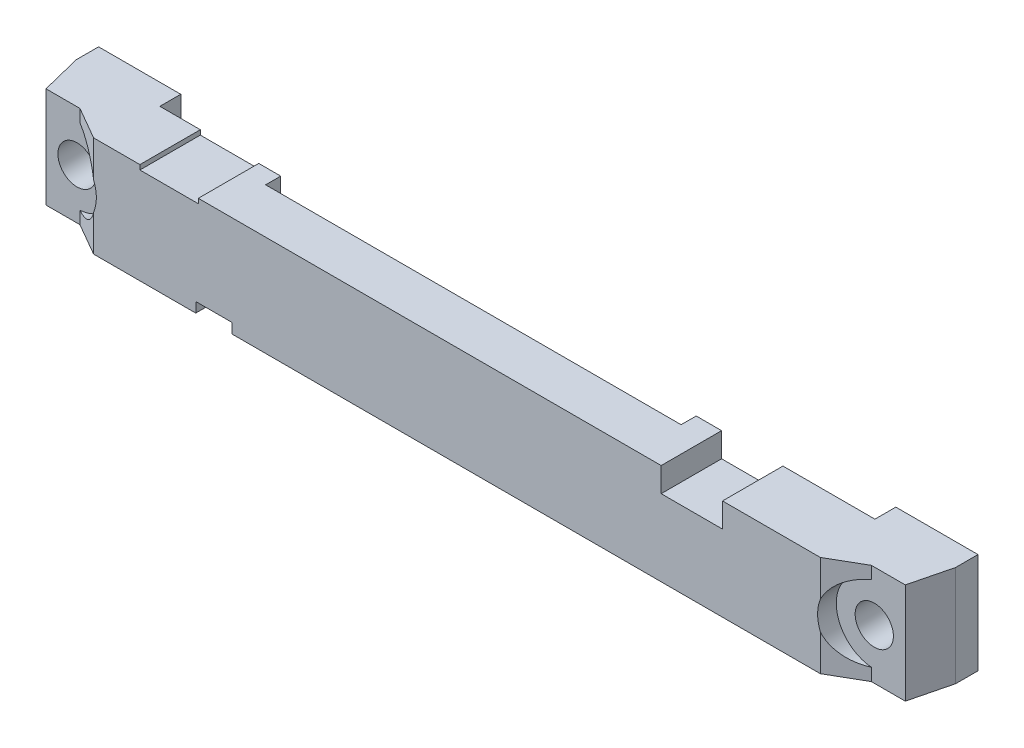
ISO-10303-21;
HEADER;
FILE_DESCRIPTION(('STEP AP214'),'2;1');
FILE_NAME('part.step','',(''),(''),'','','');
FILE_SCHEMA(('AUTOMOTIVE_DESIGN { 1 0 10303 214 1 1 1 1 }'));
ENDSEC;
DATA;
#1=APPLICATION_CONTEXT('core data for automotive mechanical design processes');
#2=APPLICATION_PROTOCOL_DEFINITION('international standard','automotive_design',2000,#1);
#3=PRODUCT_CONTEXT('',#1,'mechanical');
#4=PRODUCT('Part','Part','',(#3));
#5=PRODUCT_RELATED_PRODUCT_CATEGORY('part','',(#4));
#6=PRODUCT_DEFINITION_FORMATION('','',#4);
#7=PRODUCT_DEFINITION_CONTEXT('part definition',#1,'design');
#8=PRODUCT_DEFINITION('design','',#6,#7);
#9=PRODUCT_DEFINITION_SHAPE('','',#8);
#10=(LENGTH_UNIT() NAMED_UNIT(*) SI_UNIT(.MILLI.,.METRE.));
#11=(NAMED_UNIT(*) PLANE_ANGLE_UNIT() SI_UNIT($,.RADIAN.));
#12=(NAMED_UNIT(*) SI_UNIT($,.STERADIAN.) SOLID_ANGLE_UNIT());
#13=UNCERTAINTY_MEASURE_WITH_UNIT(LENGTH_MEASURE(1.E-05),#10,'distance_accuracy_value','');
#14=(GEOMETRIC_REPRESENTATION_CONTEXT(3) GLOBAL_UNCERTAINTY_ASSIGNED_CONTEXT((#13)) GLOBAL_UNIT_ASSIGNED_CONTEXT((#10,
#11,#12)) REPRESENTATION_CONTEXT('',''));
#15=CARTESIAN_POINT('',(0.,0.,0.));
#16=DIRECTION('',(0.,0.,1.));
#17=DIRECTION('',(1.,0.,0.));
#18=AXIS2_PLACEMENT_3D('',#15,#16,#17);
#19=CARTESIAN_POINT('',(0.,0.,0.));
#20=DIRECTION('',(0.,0.,1.));
#21=DIRECTION('',(1.,0.,0.));
#22=AXIS2_PLACEMENT_3D('',#19,#20,#21);
#23=PLANE('',#22);
#24=DIRECTION('',(1.,0.,0.));
#25=VECTOR('',#24,1.);
#26=CARTESIAN_POINT('',(0.,0.,0.));
#27=LINE('',#26,#25);
#28=CARTESIAN_POINT('',(61.4149026290676,0.,0.));
#29=VERTEX_POINT('',#28);
#30=CARTESIAN_POINT('',(79.1605080756888,0.,0.));
#31=VERTEX_POINT('',#30);
#32=EDGE_CURVE('E436',#29,#31,#27,.T.);
#33=ORIENTED_EDGE('',*,*,#32,.F.);
#34=DIRECTION('',(0.,-1.,0.));
#35=VECTOR('',#34,1.);
#36=CARTESIAN_POINT('',(61.4149026290676,10.,0.));
#37=LINE('',#36,#35);
#38=CARTESIAN_POINT('',(61.4149026290676,10.,0.));
#39=VERTEX_POINT('',#38);
#40=EDGE_CURVE('E266',#39,#29,#37,.T.);
#41=ORIENTED_EDGE('',*,*,#40,.F.);
#42=DIRECTION('',(-1.,0.,0.));
#43=VECTOR('',#42,1.);
#44=CARTESIAN_POINT('',(0.,10.,0.));
#45=LINE('',#44,#43);
#46=CARTESIAN_POINT('',(63.9370824595012,10.,0.));
#47=VERTEX_POINT('',#46);
#48=EDGE_CURVE('E454',#47,#39,#45,.T.);
#49=ORIENTED_EDGE('',*,*,#48,.F.);
#50=DIRECTION('',(0.,-1.,0.));
#51=VECTOR('',#50,1.);
#52=CARTESIAN_POINT('',(63.9370824595012,0.,0.));
#53=LINE('',#52,#51);
#54=CARTESIAN_POINT('',(63.9370824595012,7.57883713062101,0.));
#55=VERTEX_POINT('',#54);
#56=EDGE_CURVE('E348',#47,#55,#53,.T.);
#57=ORIENTED_EDGE('',*,*,#56,.T.);
#58=DIRECTION('',(1.,0.,0.));
#59=VECTOR('',#58,1.);
#60=CARTESIAN_POINT('',(0.,7.57883713062101,0.));
#61=LINE('',#60,#59);
#62=CARTESIAN_POINT('',(70.0270798995012,7.57883713062101,0.));
#63=VERTEX_POINT('',#62);
#64=EDGE_CURVE('E306',#55,#63,#61,.T.);
#65=ORIENTED_EDGE('',*,*,#64,.T.);
#66=DIRECTION('',(0.,1.,0.));
#67=VECTOR('',#66,1.);
#68=CARTESIAN_POINT('',(70.0270798995012,0.,0.));
#69=LINE('',#68,#67);
#70=CARTESIAN_POINT('',(70.0270798995012,10.,0.));
#71=VERTEX_POINT('',#70);
#72=EDGE_CURVE('E345',#63,#71,#69,.T.);
#73=ORIENTED_EDGE('',*,*,#72,.T.);
#74=CARTESIAN_POINT('',(79.1605080756888,10.,0.));
#75=VERTEX_POINT('',#74);
#76=EDGE_CURVE('E451',#75,#71,#45,.T.);
#77=ORIENTED_EDGE('',*,*,#76,.F.);
#78=DIRECTION('',(0.,1.,0.));
#79=VECTOR('',#78,1.);
#80=CARTESIAN_POINT('',(79.1605080756888,10.,0.));
#81=LINE('',#80,#79);
#82=EDGE_CURVE('E405',#31,#75,#81,.T.);
#83=ORIENTED_EDGE('',*,*,#82,.F.);
#84=EDGE_LOOP('',(#33,#41,#49,#57,#65,#73,#77,#83));
#85=FACE_BOUND('',#84,.T.);
#86=ADVANCED_FACE('F38',(#85),#23,.F.);
#87=CARTESIAN_POINT('',(21.3225938245012,0.,-2.075));
#88=DIRECTION('',(1.,0.,0.));
#89=DIRECTION('',(0.,0.,-1.));
#90=AXIS2_PLACEMENT_3D('',#87,#88,#89);
#91=PLANE('',#90);
#92=DIRECTION('',(0.,1.,0.));
#93=VECTOR('',#92,1.);
#94=CARTESIAN_POINT('',(21.3225938245012,0.,1.5));
#95=LINE('',#94,#93);
#96=CARTESIAN_POINT('',(21.3225938245012,0.,1.5));
#97=VERTEX_POINT('',#96);
#98=CARTESIAN_POINT('',(21.3225938245012,0.998319284991011,1.5));
#99=VERTEX_POINT('',#98);
#100=EDGE_CURVE('E47',#97,#99,#95,.T.);
#101=ORIENTED_EDGE('',*,*,#100,.F.);
#102=DIRECTION('',(0.,0.,1.));
#103=VECTOR('',#102,1.);
#104=CARTESIAN_POINT('',(21.3225938245012,0.,-2.075));
#105=LINE('',#104,#103);
#106=CARTESIAN_POINT('',(21.3225938245012,0.,6.));
#107=VERTEX_POINT('',#106);
#108=EDGE_CURVE('E280',#97,#107,#105,.T.);
#109=ORIENTED_EDGE('',*,*,#108,.T.);
#110=DIRECTION('',(0.,1.,0.));
#111=VECTOR('',#110,1.);
#112=CARTESIAN_POINT('',(21.3225938245012,0.,6.));
#113=LINE('',#112,#111);
#114=CARTESIAN_POINT('',(21.3225938245012,0.998319284991011,6.));
#115=VERTEX_POINT('',#114);
#116=EDGE_CURVE('E297',#107,#115,#113,.T.);
#117=ORIENTED_EDGE('',*,*,#116,.T.);
#118=DIRECTION('',(0.,0.,1.));
#119=VECTOR('',#118,1.);
#120=CARTESIAN_POINT('',(21.3225938245012,0.998319284991011,-2.075));
#121=LINE('',#120,#119);
#122=EDGE_CURVE('E307',#99,#115,#121,.T.);
#123=ORIENTED_EDGE('',*,*,#122,.F.);
#124=EDGE_LOOP('',(#101,#109,#117,#123));
#125=FACE_BOUND('',#124,.T.);
#126=ADVANCED_FACE('F529',(#125),#91,.F.);
#127=CARTESIAN_POINT('',(0.,0.,6.));
#128=DIRECTION('',(0.,1.,0.));
#129=DIRECTION('',(0.,0.,1.));
#130=AXIS2_PLACEMENT_3D('',#127,#128,#129);
#131=PLANE('',#130);
#132=CARTESIAN_POINT('',(8.16,0.,0.));
#133=VERTEX_POINT('',#132);
#134=CARTESIAN_POINT('',(17.7236099445012,0.,0.));
#135=VERTEX_POINT('',#134);
#136=EDGE_CURVE('E447',#133,#135,#27,.T.);
#137=ORIENTED_EDGE('',*,*,#136,.T.);
#138=DIRECTION('',(0.,0.,1.));
#139=VECTOR('',#138,1.);
#140=CARTESIAN_POINT('',(17.7236099445012,0.,-2.075));
#141=LINE('',#140,#139);
#142=CARTESIAN_POINT('',(17.7236099445012,0.,6.));
#143=VERTEX_POINT('',#142);
#144=EDGE_CURVE('E303',#135,#143,#141,.T.);
#145=ORIENTED_EDGE('',*,*,#144,.T.);
#146=DIRECTION('',(1.,0.,0.));
#147=VECTOR('',#146,1.);
#148=CARTESIAN_POINT('',(0.,0.,6.));
#149=LINE('',#148,#147);
#150=CARTESIAN_POINT('',(7.58000000000001,0.,6.));
#151=VERTEX_POINT('',#150);
#152=EDGE_CURVE('E437',#151,#143,#149,.T.);
#153=ORIENTED_EDGE('',*,*,#152,.F.);
#154=DIRECTION('',(-0.866025403784435,0.,-0.500000000000006));
#155=VECTOR('',#154,1.);
#156=CARTESIAN_POINT('',(4.08,0.,3.97927405783627));
#157=LINE('',#156,#155);
#158=CARTESIAN_POINT('',(4.36843139260585,0.,4.1458));
#159=VERTEX_POINT('',#158);
#160=EDGE_CURVE('E463',#151,#159,#157,.T.);
#161=ORIENTED_EDGE('',*,*,#160,.T.);
#162=DIRECTION('',(1.,0.,0.));
#163=VECTOR('',#162,1.);
#164=CARTESIAN_POINT('',(0.,0.,4.1458));
#165=LINE('',#164,#163);
#166=CARTESIAN_POINT('',(1.,0.,4.1458));
#167=VERTEX_POINT('',#166);
#168=EDGE_CURVE('E366',#167,#159,#165,.T.);
#169=ORIENTED_EDGE('',*,*,#168,.F.);
#170=DIRECTION('',(0.24253562503633,0.,0.970142500145333));
#171=VECTOR('',#170,1.);
#172=CARTESIAN_POINT('',(1.,0.,4.1458));
#173=LINE('',#172,#171);
#174=CARTESIAN_POINT('',(0.,0.,0.145799999999942));
#175=VERTEX_POINT('',#174);
#176=EDGE_CURVE('E514',#167,#175,#173,.F.);
#177=ORIENTED_EDGE('',*,*,#176,.T.);
#178=DIRECTION('',(0.,0.,-1.));
#179=VECTOR('',#178,1.);
#180=CARTESIAN_POINT('',(0.,0.,6.));
#181=LINE('',#180,#179);
#182=CARTESIAN_POINT('',(0.,0.,-2.075));
#183=VERTEX_POINT('',#182);
#184=EDGE_CURVE('E461',#175,#183,#181,.T.);
#185=ORIENTED_EDGE('',*,*,#184,.T.);
#186=DIRECTION('',(-1.,0.,0.));
#187=VECTOR('',#186,1.);
#188=CARTESIAN_POINT('',(0.,0.,-2.075));
#189=LINE('',#188,#187);
#190=CARTESIAN_POINT('',(8.16,0.,-2.075));
#191=VERTEX_POINT('',#190);
#192=EDGE_CURVE('E425',#191,#183,#189,.T.);
#193=ORIENTED_EDGE('',*,*,#192,.F.);
#194=DIRECTION('',(0.,0.,1.));
#195=VECTOR('',#194,1.);
#196=CARTESIAN_POINT('',(8.16,0.,-2.075));
#197=LINE('',#196,#195);
#198=EDGE_CURVE('E428',#191,#133,#197,.T.);
#199=ORIENTED_EDGE('',*,*,#198,.T.);
#200=EDGE_LOOP('',(#137,#145,#153,#161,#169,#177,#185,#193,#199));
#201=FACE_BOUND('',#200,.T.);
#202=ADVANCED_FACE('F545',(#201),#131,.F.);
#203=CARTESIAN_POINT('',(0.,10.,6.));
#204=DIRECTION('',(0.,-1.,0.));
#205=DIRECTION('',(0.,0.,-1.));
#206=AXIS2_PLACEMENT_3D('',#203,#204,#205);
#207=PLANE('',#206);
#208=DIRECTION('',(-1.,0.,0.));
#209=VECTOR('',#208,1.);
#210=CARTESIAN_POINT('',(0.,10.,6.));
#211=LINE('',#210,#209);
#212=CARTESIAN_POINT('',(12.1780942802832,10.,6.));
#213=VERTEX_POINT('',#212);
#214=CARTESIAN_POINT('',(7.58000000000001,10.,6.));
#215=VERTEX_POINT('',#214);
#216=EDGE_CURVE('E440',#213,#215,#211,.T.);
#217=ORIENTED_EDGE('',*,*,#216,.F.);
#218=DIRECTION('',(0.,0.,1.));
#219=VECTOR('',#218,1.);
#220=CARTESIAN_POINT('',(12.1780942802832,10.,-2.075));
#221=LINE('',#220,#219);
#222=CARTESIAN_POINT('',(12.1780942802832,10.,0.));
#223=VERTEX_POINT('',#222);
#224=EDGE_CURVE('E320',#223,#213,#221,.T.);
#225=ORIENTED_EDGE('',*,*,#224,.F.);
#226=CARTESIAN_POINT('',(8.16,10.,0.));
#227=VERTEX_POINT('',#226);
#228=EDGE_CURVE('E450',#223,#227,#45,.T.);
#229=ORIENTED_EDGE('',*,*,#228,.T.);
#230=DIRECTION('',(0.,0.,1.));
#231=VECTOR('',#230,1.);
#232=CARTESIAN_POINT('',(8.16,10.,-2.075));
#233=LINE('',#232,#231);
#234=CARTESIAN_POINT('',(8.16,10.,-2.075));
#235=VERTEX_POINT('',#234);
#236=EDGE_CURVE('E433',#235,#227,#233,.T.);
#237=ORIENTED_EDGE('',*,*,#236,.F.);
#238=DIRECTION('',(1.,0.,0.));
#239=VECTOR('',#238,1.);
#240=CARTESIAN_POINT('',(0.,10.,-2.075));
#241=LINE('',#240,#239);
#242=CARTESIAN_POINT('',(0.,10.,-2.075));
#243=VERTEX_POINT('',#242);
#244=EDGE_CURVE('E421',#243,#235,#241,.T.);
#245=ORIENTED_EDGE('',*,*,#244,.F.);
#246=DIRECTION('',(0.,0.,-1.));
#247=VECTOR('',#246,1.);
#248=CARTESIAN_POINT('',(0.,10.,6.));
#249=LINE('',#248,#247);
#250=CARTESIAN_POINT('',(0.,10.,0.145799999999942));
#251=VERTEX_POINT('',#250);
#252=EDGE_CURVE('E445',#251,#243,#249,.T.);
#253=ORIENTED_EDGE('',*,*,#252,.F.);
#254=DIRECTION('',(-0.24253562503633,0.,-0.970142500145333));
#255=VECTOR('',#254,1.);
#256=CARTESIAN_POINT('',(1.,10.,4.1458));
#257=LINE('',#256,#255);
#258=CARTESIAN_POINT('',(1.,10.,4.1458));
#259=VERTEX_POINT('',#258);
#260=EDGE_CURVE('E508',#251,#259,#257,.F.);
#261=ORIENTED_EDGE('',*,*,#260,.T.);
#262=DIRECTION('',(-1.,0.,0.));
#263=VECTOR('',#262,1.);
#264=CARTESIAN_POINT('',(0.,10.,4.1458));
#265=LINE('',#264,#263);
#266=CARTESIAN_POINT('',(4.36843139260585,10.,4.1458));
#267=VERTEX_POINT('',#266);
#268=EDGE_CURVE('E368',#267,#259,#265,.T.);
#269=ORIENTED_EDGE('',*,*,#268,.F.);
#270=DIRECTION('',(0.866025403784435,0.,0.500000000000006));
#271=VECTOR('',#270,1.);
#272=CARTESIAN_POINT('',(4.08,10.,3.97927405783627));
#273=LINE('',#272,#271);
#274=EDGE_CURVE('E485',#267,#215,#273,.T.);
#275=ORIENTED_EDGE('',*,*,#274,.T.);
#276=EDGE_LOOP('',(#217,#225,#229,#237,#245,#253,#261,#269,#275));
#277=FACE_BOUND('',#276,.T.);
#278=ADVANCED_FACE('F622',(#277),#207,.F.);
#279=ORIENTED_EDGE('',*,*,#48,.T.);
#280=DIRECTION('',(0.,0.,-1.));
#281=VECTOR('',#280,1.);
#282=CARTESIAN_POINT('',(61.4149026290676,10.,1.5));
#283=LINE('',#282,#281);
#284=CARTESIAN_POINT('',(61.4149026290676,10.,1.5));
#285=VERTEX_POINT('',#284);
#286=EDGE_CURVE('E288',#285,#39,#283,.T.);
#287=ORIENTED_EDGE('',*,*,#286,.F.);
#288=DIRECTION('',(1.,0.,0.));
#289=VECTOR('',#288,1.);
#290=CARTESIAN_POINT('',(61.4149026290676,10.,1.5));
#291=LINE('',#290,#289);
#292=CARTESIAN_POINT('',(20.16,10.,1.5));
#293=VERTEX_POINT('',#292);
#294=EDGE_CURVE('E270',#293,#285,#291,.T.);
#295=ORIENTED_EDGE('',*,*,#294,.F.);
#296=DIRECTION('',(0.,0.,-1.));
#297=VECTOR('',#296,1.);
#298=CARTESIAN_POINT('',(20.16,10.,1.5));
#299=LINE('',#298,#297);
#300=CARTESIAN_POINT('',(20.16,10.,0.));
#301=VERTEX_POINT('',#300);
#302=EDGE_CURVE('E269',#293,#301,#299,.T.);
#303=ORIENTED_EDGE('',*,*,#302,.T.);
#304=CARTESIAN_POINT('',(17.9780948402832,10.,0.));
#305=VERTEX_POINT('',#304);
#306=EDGE_CURVE('E455',#301,#305,#45,.T.);
#307=ORIENTED_EDGE('',*,*,#306,.T.);
#308=DIRECTION('',(0.,0.,1.));
#309=VECTOR('',#308,1.);
#310=CARTESIAN_POINT('',(17.9780948402832,10.,-2.075));
#311=LINE('',#310,#309);
#312=CARTESIAN_POINT('',(17.9780948402832,10.,6.));
#313=VERTEX_POINT('',#312);
#314=EDGE_CURVE('E317',#305,#313,#311,.T.);
#315=ORIENTED_EDGE('',*,*,#314,.T.);
#316=CARTESIAN_POINT('',(63.9370824595012,10.,6.));
#317=VERTEX_POINT('',#316);
#318=EDGE_CURVE('E446',#317,#313,#211,.T.);
#319=ORIENTED_EDGE('',*,*,#318,.F.);
#320=DIRECTION('',(0.,0.,1.));
#321=VECTOR('',#320,1.);
#322=CARTESIAN_POINT('',(63.9370824595012,10.,-2.075));
#323=LINE('',#322,#321);
#324=EDGE_CURVE('E294',#47,#317,#323,.T.);
#325=ORIENTED_EDGE('',*,*,#324,.F.);
#326=EDGE_LOOP('',(#279,#287,#295,#303,#307,#315,#319,#325));
#327=FACE_BOUND('',#326,.T.);
#328=ADVANCED_FACE('F560',(#327),#207,.F.);
#329=CARTESIAN_POINT('',(0.,0.,-2.075));
#330=DIRECTION('',(0.,0.,-1.));
#331=DIRECTION('',(-1.,0.,0.));
#332=AXIS2_PLACEMENT_3D('',#329,#330,#331);
#333=PLANE('',#332);
#334=DIRECTION('',(0.,1.,0.));
#335=VECTOR('',#334,1.);
#336=CARTESIAN_POINT('',(0.,0.,-2.075));
#337=LINE('',#336,#335);
#338=EDGE_CURVE('E418',#183,#243,#337,.T.);
#339=ORIENTED_EDGE('',*,*,#338,.T.);
#340=ORIENTED_EDGE('',*,*,#244,.T.);
#341=DIRECTION('',(0.,-1.,0.));
#342=VECTOR('',#341,1.);
#343=CARTESIAN_POINT('',(8.16,0.,-2.075));
#344=LINE('',#343,#342);
#345=EDGE_CURVE('E423',#235,#191,#344,.T.);
#346=ORIENTED_EDGE('',*,*,#345,.T.);
#347=ORIENTED_EDGE('',*,*,#192,.T.);
#348=EDGE_LOOP('',(#339,#340,#346,#347));
#349=FACE_BOUND('',#348,.T.);
#350=CARTESIAN_POINT('',(4.08,5.,-2.075));
#351=DIRECTION('',(0.,0.,1.));
#352=DIRECTION('',(1.,0.,0.));
#353=AXIS2_PLACEMENT_3D('',#350,#351,#352);
#354=CIRCLE('',#353,1.89865);
#355=CARTESIAN_POINT('',(5.97865,5.,-2.075));
#356=VERTEX_POINT('',#355);
#357=EDGE_CURVE('E396',#356,#356,#354,.T.);
#358=ORIENTED_EDGE('',*,*,#357,.T.);
#359=EDGE_LOOP('',(#358));
#360=FACE_BOUND('',#359,.T.);
#361=ADVANCED_FACE('F648',(#349,#360),#333,.T.);
#362=ORIENTED_EDGE('',*,*,#306,.F.);
#363=DIRECTION('',(0.,1.,0.));
#364=VECTOR('',#363,1.);
#365=CARTESIAN_POINT('',(20.16,10.,0.));
#366=LINE('',#365,#364);
#367=CARTESIAN_POINT('',(20.16,0.998319284991011,0.));
#368=VERTEX_POINT('',#367);
#369=EDGE_CURVE('E275',#368,#301,#366,.T.);
#370=ORIENTED_EDGE('',*,*,#369,.F.);
#371=DIRECTION('',(-1.,0.,0.));
#372=VECTOR('',#371,1.);
#373=CARTESIAN_POINT('',(0.,0.998319284991011,0.));
#374=LINE('',#373,#372);
#375=CARTESIAN_POINT('',(17.7236099445012,0.998319284991011,0.));
#376=VERTEX_POINT('',#375);
#377=EDGE_CURVE('E360',#368,#376,#374,.T.);
#378=ORIENTED_EDGE('',*,*,#377,.T.);
#379=DIRECTION('',(0.,-1.,0.));
#380=VECTOR('',#379,1.);
#381=CARTESIAN_POINT('',(17.7236099445012,0.,0.));
#382=LINE('',#381,#380);
#383=EDGE_CURVE('E362',#376,#135,#382,.T.);
#384=ORIENTED_EDGE('',*,*,#383,.T.);
#385=ORIENTED_EDGE('',*,*,#136,.F.);
#386=DIRECTION('',(0.,-1.,0.));
#387=VECTOR('',#386,1.);
#388=CARTESIAN_POINT('',(8.16,0.,0.));
#389=LINE('',#388,#387);
#390=EDGE_CURVE('E408',#227,#133,#389,.T.);
#391=ORIENTED_EDGE('',*,*,#390,.F.);
#392=ORIENTED_EDGE('',*,*,#228,.F.);
#393=DIRECTION('',(0.,-1.,0.));
#394=VECTOR('',#393,1.);
#395=CARTESIAN_POINT('',(12.1780942802831,0.,0.));
#396=LINE('',#395,#394);
#397=CARTESIAN_POINT('',(12.1780942802832,9.53386632749101,0.));
#398=VERTEX_POINT('',#397);
#399=EDGE_CURVE('E357',#223,#398,#396,.T.);
#400=ORIENTED_EDGE('',*,*,#399,.T.);
#401=DIRECTION('',(1.,0.,0.));
#402=VECTOR('',#401,1.);
#403=CARTESIAN_POINT('',(0.,9.53386632749101,0.));
#404=LINE('',#403,#402);
#405=CARTESIAN_POINT('',(17.9780948402832,9.53386632749101,0.));
#406=VERTEX_POINT('',#405);
#407=EDGE_CURVE('E351',#398,#406,#404,.T.);
#408=ORIENTED_EDGE('',*,*,#407,.T.);
#409=DIRECTION('',(0.,1.,0.));
#410=VECTOR('',#409,1.);
#411=CARTESIAN_POINT('',(17.9780948402832,0.,0.));
#412=LINE('',#411,#410);
#413=EDGE_CURVE('E354',#406,#305,#412,.T.);
#414=ORIENTED_EDGE('',*,*,#413,.T.);
#415=EDGE_LOOP('',(#362,#370,#378,#384,#385,#391,#392,#400,#408,#414));
#416=FACE_BOUND('',#415,.T.);
#417=ADVANCED_FACE('F541',(#416),#23,.F.);
#418=CARTESIAN_POINT('',(0.,10.,6.));
#419=DIRECTION('',(1.,0.,0.));
#420=DIRECTION('',(0.,0.,-1.));
#421=AXIS2_PLACEMENT_3D('',#418,#419,#420);
#422=PLANE('',#421);
#423=ORIENTED_EDGE('',*,*,#184,.F.);
#424=DIRECTION('',(0.,1.,0.));
#425=VECTOR('',#424,1.);
#426=CARTESIAN_POINT('',(0.,10.,0.145799999999942));
#427=LINE('',#426,#425);
#428=EDGE_CURVE('E521',#175,#251,#427,.T.);
#429=ORIENTED_EDGE('',*,*,#428,.T.);
#430=ORIENTED_EDGE('',*,*,#252,.T.);
#431=ORIENTED_EDGE('',*,*,#338,.F.);
#432=EDGE_LOOP('',(#423,#429,#430,#431));
#433=FACE_BOUND('',#432,.T.);
#434=ADVANCED_FACE('F643',(#433),#422,.F.);
#435=DIRECTION('',(-1.,0.,0.));
#436=VECTOR('',#435,1.);
#437=CARTESIAN_POINT('',(61.4149026290676,0.,1.5));
#438=LINE('',#437,#436);
#439=CARTESIAN_POINT('',(61.4149026290676,0.,1.5));
#440=VERTEX_POINT('',#439);
#441=EDGE_CURVE('E54',#440,#97,#438,.T.);
#442=ORIENTED_EDGE('',*,*,#441,.F.);
#443=DIRECTION('',(0.,0.,-1.));
#444=VECTOR('',#443,1.);
#445=CARTESIAN_POINT('',(61.4149026290676,0.,1.5));
#446=LINE('',#445,#444);
#447=EDGE_CURVE('E261',#440,#29,#446,.T.);
#448=ORIENTED_EDGE('',*,*,#447,.T.);
#449=ORIENTED_EDGE('',*,*,#32,.T.);
#450=DIRECTION('',(0.,0.,1.));
#451=VECTOR('',#450,1.);
#452=CARTESIAN_POINT('',(79.1605080756888,0.,-2.075));
#453=LINE('',#452,#451);
#454=CARTESIAN_POINT('',(79.1605080756888,0.,-2.075));
#455=VERTEX_POINT('',#454);
#456=EDGE_CURVE('E399',#455,#31,#453,.T.);
#457=ORIENTED_EDGE('',*,*,#456,.F.);
#458=DIRECTION('',(-1.,0.,0.));
#459=VECTOR('',#458,1.);
#460=CARTESIAN_POINT('',(87.3205080756888,0.,-2.075));
#461=LINE('',#460,#459);
#462=CARTESIAN_POINT('',(87.3205080756888,0.,-2.075));
#463=VERTEX_POINT('',#462);
#464=EDGE_CURVE('E414',#463,#455,#461,.T.);
#465=ORIENTED_EDGE('',*,*,#464,.F.);
#466=DIRECTION('',(0.,0.,-1.));
#467=VECTOR('',#466,1.);
#468=CARTESIAN_POINT('',(87.3205080756888,0.,6.));
#469=LINE('',#468,#467);
#470=CARTESIAN_POINT('',(87.3205080756888,0.,0.145799999999929));
#471=VERTEX_POINT('',#470);
#472=EDGE_CURVE('E459',#471,#463,#469,.T.);
#473=ORIENTED_EDGE('',*,*,#472,.F.);
#474=DIRECTION('',(0.242535625036329,0.,-0.970142500145333));
#475=VECTOR('',#474,1.);
#476=CARTESIAN_POINT('',(86.3205080756888,0.,4.1458));
#477=LINE('',#476,#475);
#478=CARTESIAN_POINT('',(86.3205080756888,0.,4.1458));
#479=VERTEX_POINT('',#478);
#480=EDGE_CURVE('E516',#471,#479,#477,.F.);
#481=ORIENTED_EDGE('',*,*,#480,.T.);
#482=DIRECTION('',(1.,0.,0.));
#483=VECTOR('',#482,1.);
#484=CARTESIAN_POINT('',(87.3205080756888,0.,4.1458));
#485=LINE('',#484,#483);
#486=CARTESIAN_POINT('',(82.9520766830829,0.,4.1458));
#487=VERTEX_POINT('',#486);
#488=EDGE_CURVE('E365',#487,#479,#485,.T.);
#489=ORIENTED_EDGE('',*,*,#488,.F.);
#490=DIRECTION('',(-0.866025403784436,0.,0.500000000000005));
#491=VECTOR('',#490,1.);
#492=CARTESIAN_POINT('',(83.2405080756888,0.,3.97927405783627));
#493=LINE('',#492,#491);
#494=CARTESIAN_POINT('',(79.7405080756888,0.,6.));
#495=VERTEX_POINT('',#494);
#496=EDGE_CURVE('E466',#487,#495,#493,.T.);
#497=ORIENTED_EDGE('',*,*,#496,.T.);
#498=EDGE_CURVE('E441',#107,#495,#149,.T.);
#499=ORIENTED_EDGE('',*,*,#498,.F.);
#500=ORIENTED_EDGE('',*,*,#108,.F.);
#501=EDGE_LOOP('',(#442,#448,#449,#457,#465,#473,#481,#489,#497,#499,#500));
#502=FACE_BOUND('',#501,.T.);
#503=ADVANCED_FACE('F278',(#502),#131,.F.);
#504=CARTESIAN_POINT('',(87.3205080756888,10.,6.));
#505=DIRECTION('',(-1.,0.,0.));
#506=DIRECTION('',(0.,0.,1.));
#507=AXIS2_PLACEMENT_3D('',#504,#505,#506);
#508=PLANE('',#507);
#509=DIRECTION('',(0.,0.,-1.));
#510=VECTOR('',#509,1.);
#511=CARTESIAN_POINT('',(87.3205080756888,10.,6.));
#512=LINE('',#511,#510);
#513=CARTESIAN_POINT('',(87.3205080756888,10.,0.145799999999929));
#514=VERTEX_POINT('',#513);
#515=CARTESIAN_POINT('',(87.3205080756888,10.,-2.075));
#516=VERTEX_POINT('',#515);
#517=EDGE_CURVE('E457',#514,#516,#512,.T.);
#518=ORIENTED_EDGE('',*,*,#517,.F.);
#519=DIRECTION('',(0.,-1.,0.));
#520=VECTOR('',#519,1.);
#521=CARTESIAN_POINT('',(87.3205080756888,10.,0.145799999999929));
#522=LINE('',#521,#520);
#523=EDGE_CURVE('E512',#514,#471,#522,.T.);
#524=ORIENTED_EDGE('',*,*,#523,.T.);
#525=ORIENTED_EDGE('',*,*,#472,.T.);
#526=DIRECTION('',(0.,-1.,0.));
#527=VECTOR('',#526,1.);
#528=CARTESIAN_POINT('',(87.3205080756888,10.,-2.075));
#529=LINE('',#528,#527);
#530=EDGE_CURVE('E409',#516,#463,#529,.T.);
#531=ORIENTED_EDGE('',*,*,#530,.F.);
#532=EDGE_LOOP('',(#518,#524,#525,#531));
#533=FACE_BOUND('',#532,.T.);
#534=ADVANCED_FACE('F683',(#533),#508,.F.);
#535=ORIENTED_EDGE('',*,*,#76,.T.);
#536=DIRECTION('',(0.,0.,1.));
#537=VECTOR('',#536,1.);
#538=CARTESIAN_POINT('',(70.0270798995012,10.,-2.075));
#539=LINE('',#538,#537);
#540=CARTESIAN_POINT('',(70.0270798995012,10.,6.));
#541=VERTEX_POINT('',#540);
#542=EDGE_CURVE('E334',#71,#541,#539,.T.);
#543=ORIENTED_EDGE('',*,*,#542,.T.);
#544=CARTESIAN_POINT('',(79.7405080756888,10.,6.));
#545=VERTEX_POINT('',#544);
#546=EDGE_CURVE('E442',#545,#541,#211,.T.);
#547=ORIENTED_EDGE('',*,*,#546,.F.);
#548=DIRECTION('',(0.866025403784436,0.,-0.500000000000005));
#549=VECTOR('',#548,1.);
#550=CARTESIAN_POINT('',(83.2405080756888,10.,3.97927405783627));
#551=LINE('',#550,#549);
#552=CARTESIAN_POINT('',(82.9520766830829,10.,4.1458));
#553=VERTEX_POINT('',#552);
#554=EDGE_CURVE('E488',#545,#553,#551,.T.);
#555=ORIENTED_EDGE('',*,*,#554,.T.);
#556=DIRECTION('',(-1.,0.,0.));
#557=VECTOR('',#556,1.);
#558=CARTESIAN_POINT('',(87.3205080756888,10.,4.1458));
#559=LINE('',#558,#557);
#560=CARTESIAN_POINT('',(86.3205080756888,10.,4.1458));
#561=VERTEX_POINT('',#560);
#562=EDGE_CURVE('E369',#561,#553,#559,.T.);
#563=ORIENTED_EDGE('',*,*,#562,.F.);
#564=DIRECTION('',(-0.242535625036329,0.,0.970142500145333));
#565=VECTOR('',#564,1.);
#566=CARTESIAN_POINT('',(86.3205080756888,10.,4.1458));
#567=LINE('',#566,#565);
#568=EDGE_CURVE('E510',#561,#514,#567,.F.);
#569=ORIENTED_EDGE('',*,*,#568,.T.);
#570=ORIENTED_EDGE('',*,*,#517,.T.);
#571=DIRECTION('',(1.,0.,0.));
#572=VECTOR('',#571,1.);
#573=CARTESIAN_POINT('',(87.3205080756888,10.,-2.075));
#574=LINE('',#573,#572);
#575=CARTESIAN_POINT('',(79.1605080756888,10.,-2.075));
#576=VERTEX_POINT('',#575);
#577=EDGE_CURVE('E404',#576,#516,#574,.T.);
#578=ORIENTED_EDGE('',*,*,#577,.F.);
#579=DIRECTION('',(0.,0.,1.));
#580=VECTOR('',#579,1.);
#581=CARTESIAN_POINT('',(79.1605080756888,10.,-2.075));
#582=LINE('',#581,#580);
#583=EDGE_CURVE('E402',#576,#75,#582,.T.);
#584=ORIENTED_EDGE('',*,*,#583,.T.);
#585=EDGE_LOOP('',(#535,#543,#547,#555,#563,#569,#570,#578,#584));
#586=FACE_BOUND('',#585,.T.);
#587=ADVANCED_FACE('F586',(#586),#207,.F.);
#588=CARTESIAN_POINT('',(0.,0.,6.));
#589=DIRECTION('',(0.,0.,1.));
#590=DIRECTION('',(1.,0.,0.));
#591=AXIS2_PLACEMENT_3D('',#588,#589,#590);
#592=PLANE('',#591);
#593=DIRECTION('',(0.,-1.,0.));
#594=VECTOR('',#593,1.);
#595=CARTESIAN_POINT('',(17.7236099445012,0.,6.));
#596=LINE('',#595,#594);
#597=CARTESIAN_POINT('',(17.7236099445012,0.998319284991011,6.));
#598=VERTEX_POINT('',#597);
#599=EDGE_CURVE('E295',#598,#143,#596,.T.);
#600=ORIENTED_EDGE('',*,*,#599,.F.);
#601=DIRECTION('',(-1.,0.,0.));
#602=VECTOR('',#601,1.);
#603=CARTESIAN_POINT('',(17.7236099445012,0.998319284991011,6.));
#604=LINE('',#603,#602);
#605=EDGE_CURVE('E300',#115,#598,#604,.T.);
#606=ORIENTED_EDGE('',*,*,#605,.F.);
#607=ORIENTED_EDGE('',*,*,#116,.F.);
#608=ORIENTED_EDGE('',*,*,#498,.T.);
#609=DIRECTION('',(0.,1.,0.));
#610=VECTOR('',#609,1.);
#611=CARTESIAN_POINT('',(79.7405080756888,1.22937,6.));
#612=LINE('',#611,#610);
#613=CARTESIAN_POINT('',(79.7405080756888,3.59727030511939,6.));
#614=VERTEX_POINT('',#613);
#615=EDGE_CURVE('E478',#495,#614,#612,.T.);
#616=ORIENTED_EDGE('',*,*,#615,.T.);
#617=CARTESIAN_POINT('',(83.2405080756888,5.,6.));
#618=DIRECTION('',(0.,0.,1.));
#619=DIRECTION('',(1.,0.,0.));
#620=AXIS2_PLACEMENT_3D('',#617,#618,#619);
#621=CIRCLE('',#620,3.77063);
#622=CARTESIAN_POINT('',(79.7405080756888,6.40272969488061,6.));
#623=VERTEX_POINT('',#622);
#624=EDGE_CURVE('E372',#623,#614,#621,.T.);
#625=ORIENTED_EDGE('',*,*,#624,.F.);
#626=DIRECTION('',(0.,1.,0.));
#627=VECTOR('',#626,1.);
#628=CARTESIAN_POINT('',(79.7405080756888,10.,6.));
#629=LINE('',#628,#627);
#630=EDGE_CURVE('E475',#623,#545,#629,.T.);
#631=ORIENTED_EDGE('',*,*,#630,.T.);
#632=ORIENTED_EDGE('',*,*,#546,.T.);
#633=DIRECTION('',(0.,1.,0.));
#634=VECTOR('',#633,1.);
#635=CARTESIAN_POINT('',(70.0270798995012,10.,6.));
#636=LINE('',#635,#634);
#637=CARTESIAN_POINT('',(70.0270798995012,7.57883713062101,6.));
#638=VERTEX_POINT('',#637);
#639=EDGE_CURVE('E331',#638,#541,#636,.T.);
#640=ORIENTED_EDGE('',*,*,#639,.F.);
#641=DIRECTION('',(1.,0.,0.));
#642=VECTOR('',#641,1.);
#643=CARTESIAN_POINT('',(63.9370824595012,7.57883713062101,6.));
#644=LINE('',#643,#642);
#645=CARTESIAN_POINT('',(63.9370824595012,7.57883713062101,6.));
#646=VERTEX_POINT('',#645);
#647=EDGE_CURVE('E339',#646,#638,#644,.T.);
#648=ORIENTED_EDGE('',*,*,#647,.F.);
#649=DIRECTION('',(0.,-1.,0.));
#650=VECTOR('',#649,1.);
#651=CARTESIAN_POINT('',(63.9370824595012,10.,6.));
#652=LINE('',#651,#650);
#653=EDGE_CURVE('E322',#317,#646,#652,.T.);
#654=ORIENTED_EDGE('',*,*,#653,.F.);
#655=ORIENTED_EDGE('',*,*,#318,.T.);
#656=DIRECTION('',(0.,1.,0.));
#657=VECTOR('',#656,1.);
#658=CARTESIAN_POINT('',(17.9780948402832,10.,6.));
#659=LINE('',#658,#657);
#660=CARTESIAN_POINT('',(17.9780948402832,9.53386632749101,6.));
#661=VERTEX_POINT('',#660);
#662=EDGE_CURVE('E314',#661,#313,#659,.T.);
#663=ORIENTED_EDGE('',*,*,#662,.F.);
#664=DIRECTION('',(1.,0.,0.));
#665=VECTOR('',#664,1.);
#666=CARTESIAN_POINT('',(12.1780942802832,9.53386632749101,6.));
#667=LINE('',#666,#665);
#668=CARTESIAN_POINT('',(12.1780942802832,9.53386632749101,6.));
#669=VERTEX_POINT('',#668);
#670=EDGE_CURVE('E324',#669,#661,#667,.T.);
#671=ORIENTED_EDGE('',*,*,#670,.F.);
#672=DIRECTION('',(0.,-1.,0.));
#673=VECTOR('',#672,1.);
#674=CARTESIAN_POINT('',(12.1780942802832,10.,6.));
#675=LINE('',#674,#673);
#676=EDGE_CURVE('E62',#213,#669,#675,.T.);
#677=ORIENTED_EDGE('',*,*,#676,.F.);
#678=ORIENTED_EDGE('',*,*,#216,.T.);
#679=DIRECTION('',(0.,-1.,0.));
#680=VECTOR('',#679,1.);
#681=CARTESIAN_POINT('',(7.58000000000001,8.77063,6.));
#682=LINE('',#681,#680);
#683=CARTESIAN_POINT('',(7.58000000000001,6.40272969488063,6.));
#684=VERTEX_POINT('',#683);
#685=EDGE_CURVE('E469',#215,#684,#682,.T.);
#686=ORIENTED_EDGE('',*,*,#685,.T.);
#687=CARTESIAN_POINT('',(4.08,5.,6.));
#688=DIRECTION('',(0.,0.,1.));
#689=DIRECTION('',(1.,0.,0.));
#690=AXIS2_PLACEMENT_3D('',#687,#688,#689);
#691=CIRCLE('',#690,3.77063);
#692=CARTESIAN_POINT('',(7.58000000000001,3.59727030511937,6.));
#693=VERTEX_POINT('',#692);
#694=EDGE_CURVE('E387',#693,#684,#691,.T.);
#695=ORIENTED_EDGE('',*,*,#694,.F.);
#696=DIRECTION('',(0.,-1.,0.));
#697=VECTOR('',#696,1.);
#698=CARTESIAN_POINT('',(7.58000000000001,0.,6.));
#699=LINE('',#698,#697);
#700=EDGE_CURVE('E472',#693,#151,#699,.T.);
#701=ORIENTED_EDGE('',*,*,#700,.T.);
#702=ORIENTED_EDGE('',*,*,#152,.T.);
#703=EDGE_LOOP('',(#600,#606,#607,#608,#616,#625,#631,#632,#640,#648,#654,#655,#663,#671,#677,
#678,#686,#695,#701,#702));
#704=FACE_BOUND('',#703,.T.);
#705=ADVANCED_FACE('F534',(#704),#592,.T.);
#706=CARTESIAN_POINT('',(8.16,0.,-2.075));
#707=DIRECTION('',(-1.,0.,0.));
#708=DIRECTION('',(0.,0.,1.));
#709=AXIS2_PLACEMENT_3D('',#706,#707,#708);
#710=PLANE('',#709);
#711=ORIENTED_EDGE('',*,*,#390,.T.);
#712=ORIENTED_EDGE('',*,*,#198,.F.);
#713=ORIENTED_EDGE('',*,*,#345,.F.);
#714=ORIENTED_EDGE('',*,*,#236,.T.);
#715=EDGE_LOOP('',(#711,#712,#713,#714));
#716=FACE_BOUND('',#715,.T.);
#717=ADVANCED_FACE('F551',(#716),#710,.F.);
#718=CARTESIAN_POINT('',(79.1605080756888,10.,-2.075));
#719=DIRECTION('',(1.,0.,0.));
#720=DIRECTION('',(0.,0.,-1.));
#721=AXIS2_PLACEMENT_3D('',#718,#719,#720);
#722=PLANE('',#721);
#723=ORIENTED_EDGE('',*,*,#82,.T.);
#724=ORIENTED_EDGE('',*,*,#583,.F.);
#725=DIRECTION('',(0.,1.,0.));
#726=VECTOR('',#725,1.);
#727=CARTESIAN_POINT('',(79.1605080756888,10.,-2.075));
#728=LINE('',#727,#726);
#729=EDGE_CURVE('E412',#455,#576,#728,.T.);
#730=ORIENTED_EDGE('',*,*,#729,.F.);
#731=ORIENTED_EDGE('',*,*,#456,.T.);
#732=EDGE_LOOP('',(#723,#724,#730,#731));
#733=FACE_BOUND('',#732,.T.);
#734=ADVANCED_FACE('F569',(#733),#722,.F.);
#735=CARTESIAN_POINT('',(0.,0.,-2.075));
#736=DIRECTION('',(0.,0.,-1.));
#737=DIRECTION('',(-1.,0.,0.));
#738=AXIS2_PLACEMENT_3D('',#735,#736,#737);
#739=PLANE('',#738);
#740=CARTESIAN_POINT('',(83.2405080756888,5.,-2.075));
#741=DIRECTION('',(0.,0.,1.));
#742=DIRECTION('',(1.,0.,0.));
#743=AXIS2_PLACEMENT_3D('',#740,#741,#742);
#744=CIRCLE('',#743,1.89865);
#745=CARTESIAN_POINT('',(85.1391580756888,5.,-2.075));
#746=VERTEX_POINT('',#745);
#747=EDGE_CURVE('E384',#746,#746,#744,.T.);
#748=ORIENTED_EDGE('',*,*,#747,.T.);
#749=EDGE_LOOP('',(#748));
#750=FACE_BOUND('',#749,.T.);
#751=ORIENTED_EDGE('',*,*,#530,.T.);
#752=ORIENTED_EDGE('',*,*,#464,.T.);
#753=ORIENTED_EDGE('',*,*,#729,.T.);
#754=ORIENTED_EDGE('',*,*,#577,.T.);
#755=EDGE_LOOP('',(#751,#752,#753,#754));
#756=FACE_BOUND('',#755,.T.);
#757=ADVANCED_FACE('F573',(#750,#756),#739,.T.);
#758=CARTESIAN_POINT('',(4.08,5.,6.));
#759=DIRECTION('',(0.,0.,1.));
#760=DIRECTION('',(1.,0.,0.));
#761=AXIS2_PLACEMENT_3D('',#758,#759,#760);
#762=CYLINDRICAL_SURFACE('',#761,1.89865);
#763=ORIENTED_EDGE('',*,*,#357,.F.);
#764=EDGE_LOOP('',(#763));
#765=FACE_BOUND('',#764,.T.);
#766=CARTESIAN_POINT('',(4.08,5.,4.1458));
#767=DIRECTION('',(0.,0.,1.));
#768=DIRECTION('',(1.,0.,0.));
#769=AXIS2_PLACEMENT_3D('',#766,#767,#768);
#770=CIRCLE('',#769,1.89865);
#771=CARTESIAN_POINT('',(5.97865,5.,4.1458));
#772=VERTEX_POINT('',#771);
#773=EDGE_CURVE('E393',#772,#772,#770,.T.);
#774=ORIENTED_EDGE('',*,*,#773,.T.);
#775=EDGE_LOOP('',(#774));
#776=FACE_BOUND('',#775,.T.);
#777=ADVANCED_FACE('F654',(#765,#776),#762,.F.);
#778=CARTESIAN_POINT('',(5.97865,5.,4.1458));
#779=DIRECTION('',(0.,0.,-1.));
#780=DIRECTION('',(-1.,0.,0.));
#781=AXIS2_PLACEMENT_3D('',#778,#779,#780);
#782=PLANE('',#781);
#783=ORIENTED_EDGE('',*,*,#773,.F.);
#784=EDGE_LOOP('',(#783));
#785=FACE_BOUND('',#784,.T.);
#786=ORIENTED_EDGE('',*,*,#268,.T.);
#787=DIRECTION('',(0.,-1.,0.));
#788=VECTOR('',#787,1.);
#789=CARTESIAN_POINT('',(1.,5.,4.1458));
#790=LINE('',#789,#788);
#791=EDGE_CURVE('E518',#259,#167,#790,.T.);
#792=ORIENTED_EDGE('',*,*,#791,.T.);
#793=ORIENTED_EDGE('',*,*,#168,.T.);
#794=DIRECTION('',(0.,1.,0.));
#795=VECTOR('',#794,1.);
#796=CARTESIAN_POINT('',(4.36843139260585,5.,4.1458));
#797=LINE('',#796,#795);
#798=CARTESIAN_POINT('',(4.36843139260585,1.24041785185382,4.1458));
#799=VERTEX_POINT('',#798);
#800=EDGE_CURVE('E500',#159,#799,#797,.T.);
#801=ORIENTED_EDGE('',*,*,#800,.T.);
#802=CARTESIAN_POINT('',(4.08,5.,4.1458));
#803=DIRECTION('',(0.,0.,1.));
#804=DIRECTION('',(1.,0.,0.));
#805=AXIS2_PLACEMENT_3D('',#802,#803,#804);
#806=CIRCLE('',#805,3.77063);
#807=CARTESIAN_POINT('',(4.36843139260585,8.75958214814618,4.1458));
#808=VERTEX_POINT('',#807);
#809=EDGE_CURVE('E390',#799,#808,#806,.T.);
#810=ORIENTED_EDGE('',*,*,#809,.T.);
#811=DIRECTION('',(0.,1.,0.));
#812=VECTOR('',#811,1.);
#813=CARTESIAN_POINT('',(4.36843139260585,5.,4.1458));
#814=LINE('',#813,#812);
#815=EDGE_CURVE('E502',#808,#267,#814,.T.);
#816=ORIENTED_EDGE('',*,*,#815,.T.);
#817=EDGE_LOOP('',(#786,#792,#793,#801,#810,#816));
#818=FACE_BOUND('',#817,.T.);
#819=ADVANCED_FACE('F631',(#785,#818),#782,.F.);
#820=CARTESIAN_POINT('',(4.08,5.,6.));
#821=DIRECTION('',(0.,0.,1.));
#822=DIRECTION('',(1.,0.,0.));
#823=AXIS2_PLACEMENT_3D('',#820,#821,#822);
#824=CYLINDRICAL_SURFACE('',#823,3.77063);
#825=ORIENTED_EDGE('',*,*,#809,.F.);
#826=CARTESIAN_POINT('',(4.08,5.,3.97927405783627));
#827=DIRECTION('',(-0.500000000000006,0.,0.866025403784435));
#828=DIRECTION('',(0.866025403784435,0.,0.500000000000006));
#829=AXIS2_PLACEMENT_3D('',#826,#827,#828);
#830=ELLIPSE('',#829,4.35394849102897,3.77063);
#831=EDGE_CURVE('E493',#799,#693,#830,.T.);
#832=ORIENTED_EDGE('',*,*,#831,.T.);
#833=ORIENTED_EDGE('',*,*,#694,.T.);
#834=CARTESIAN_POINT('',(4.08,5.,3.97927405783627));
#835=DIRECTION('',(-0.500000000000006,0.,0.866025403784435));
#836=DIRECTION('',(0.866025403784435,0.,0.500000000000006));
#837=AXIS2_PLACEMENT_3D('',#834,#835,#836);
#838=ELLIPSE('',#837,4.35394849102897,3.77063);
#839=EDGE_CURVE('E491',#684,#808,#838,.T.);
#840=ORIENTED_EDGE('',*,*,#839,.T.);
#841=EDGE_LOOP('',(#825,#832,#833,#840));
#842=FACE_BOUND('',#841,.T.);
#843=ADVANCED_FACE('F628',(#842),#824,.F.);
#844=CARTESIAN_POINT('',(83.2405080756888,5.,6.));
#845=DIRECTION('',(0.,0.,1.));
#846=DIRECTION('',(1.,0.,0.));
#847=AXIS2_PLACEMENT_3D('',#844,#845,#846);
#848=CYLINDRICAL_SURFACE('',#847,1.89865);
#849=ORIENTED_EDGE('',*,*,#747,.F.);
#850=EDGE_LOOP('',(#849));
#851=FACE_BOUND('',#850,.T.);
#852=CARTESIAN_POINT('',(83.2405080756888,5.,4.1458));
#853=DIRECTION('',(0.,0.,1.));
#854=DIRECTION('',(1.,0.,0.));
#855=AXIS2_PLACEMENT_3D('',#852,#853,#854);
#856=CIRCLE('',#855,1.89865);
#857=CARTESIAN_POINT('',(85.1391580756888,5.,4.1458));
#858=VERTEX_POINT('',#857);
#859=EDGE_CURVE('E381',#858,#858,#856,.T.);
#860=ORIENTED_EDGE('',*,*,#859,.T.);
#861=EDGE_LOOP('',(#860));
#862=FACE_BOUND('',#861,.T.);
#863=ADVANCED_FACE('F665',(#851,#862),#848,.F.);
#864=CARTESIAN_POINT('',(85.1391580756888,5.,4.1458));
#865=DIRECTION('',(0.,0.,-1.));
#866=DIRECTION('',(-1.,0.,0.));
#867=AXIS2_PLACEMENT_3D('',#864,#865,#866);
#868=PLANE('',#867);
#869=ORIENTED_EDGE('',*,*,#859,.F.);
#870=EDGE_LOOP('',(#869));
#871=FACE_BOUND('',#870,.T.);
#872=ORIENTED_EDGE('',*,*,#488,.T.);
#873=DIRECTION('',(0.,1.,0.));
#874=VECTOR('',#873,1.);
#875=CARTESIAN_POINT('',(86.3205080756888,5.,4.1458));
#876=LINE('',#875,#874);
#877=EDGE_CURVE('E505',#479,#561,#876,.T.);
#878=ORIENTED_EDGE('',*,*,#877,.T.);
#879=ORIENTED_EDGE('',*,*,#562,.T.);
#880=DIRECTION('',(0.,-1.,0.));
#881=VECTOR('',#880,1.);
#882=CARTESIAN_POINT('',(82.9520766830829,5.,4.1458));
#883=LINE('',#882,#881);
#884=CARTESIAN_POINT('',(82.9520766830829,8.75958214814618,4.1458));
#885=VERTEX_POINT('',#884);
#886=EDGE_CURVE('E498',#553,#885,#883,.T.);
#887=ORIENTED_EDGE('',*,*,#886,.T.);
#888=CARTESIAN_POINT('',(83.2405080756888,5.,4.1458));
#889=DIRECTION('',(0.,0.,1.));
#890=DIRECTION('',(1.,0.,0.));
#891=AXIS2_PLACEMENT_3D('',#888,#889,#890);
#892=CIRCLE('',#891,3.77063);
#893=CARTESIAN_POINT('',(82.9520766830829,1.24041785185382,4.1458));
#894=VERTEX_POINT('',#893);
#895=EDGE_CURVE('E378',#885,#894,#892,.T.);
#896=ORIENTED_EDGE('',*,*,#895,.T.);
#897=DIRECTION('',(0.,-1.,0.));
#898=VECTOR('',#897,1.);
#899=CARTESIAN_POINT('',(82.9520766830829,5.,4.1458));
#900=LINE('',#899,#898);
#901=EDGE_CURVE('E495',#894,#487,#900,.T.);
#902=ORIENTED_EDGE('',*,*,#901,.T.);
#903=EDGE_LOOP('',(#872,#878,#879,#887,#896,#902));
#904=FACE_BOUND('',#903,.T.);
#905=ADVANCED_FACE('F584',(#871,#904),#868,.F.);
#906=CARTESIAN_POINT('',(83.2405080756888,5.,6.));
#907=DIRECTION('',(0.,0.,1.));
#908=DIRECTION('',(1.,0.,0.));
#909=AXIS2_PLACEMENT_3D('',#906,#907,#908);
#910=CYLINDRICAL_SURFACE('',#909,3.77063);
#911=ORIENTED_EDGE('',*,*,#624,.T.);
#912=CARTESIAN_POINT('',(83.2405080756888,5.,3.97927405783627));
#913=DIRECTION('',(0.500000000000005,0.,0.866025403784436));
#914=DIRECTION('',(-0.866025403784436,0.,0.500000000000005));
#915=AXIS2_PLACEMENT_3D('',#912,#913,#914);
#916=ELLIPSE('',#915,4.35394849102897,3.77063);
#917=EDGE_CURVE('E483',#614,#894,#916,.T.);
#918=ORIENTED_EDGE('',*,*,#917,.T.);
#919=ORIENTED_EDGE('',*,*,#895,.F.);
#920=CARTESIAN_POINT('',(83.2405080756888,5.,3.97927405783627));
#921=DIRECTION('',(0.500000000000005,0.,0.866025403784436));
#922=DIRECTION('',(-0.866025403784436,0.,0.500000000000005));
#923=AXIS2_PLACEMENT_3D('',#920,#921,#922);
#924=ELLIPSE('',#923,4.35394849102897,3.77063);
#925=EDGE_CURVE('E481',#885,#623,#924,.T.);
#926=ORIENTED_EDGE('',*,*,#925,.T.);
#927=EDGE_LOOP('',(#911,#918,#919,#926));
#928=FACE_BOUND('',#927,.T.);
#929=ADVANCED_FACE('F597',(#928),#910,.F.);
#930=CARTESIAN_POINT('',(83.2405080756888,10.,3.97927405783627));
#931=DIRECTION('',(0.500000000000005,0.,0.866025403784436));
#932=DIRECTION('',(0.,1.,0.));
#933=AXIS2_PLACEMENT_3D('',#930,#931,#932);
#934=PLANE('',#933);
#935=ORIENTED_EDGE('',*,*,#917,.F.);
#936=ORIENTED_EDGE('',*,*,#615,.F.);
#937=ORIENTED_EDGE('',*,*,#496,.F.);
#938=ORIENTED_EDGE('',*,*,#901,.F.);
#939=EDGE_LOOP('',(#935,#936,#937,#938));
#940=FACE_BOUND('',#939,.T.);
#941=ADVANCED_FACE('F601',(#940),#934,.T.);
#942=CARTESIAN_POINT('',(83.2405080756888,10.,3.97927405783627));
#943=DIRECTION('',(0.500000000000005,0.,0.866025403784436));
#944=DIRECTION('',(0.,1.,0.));
#945=AXIS2_PLACEMENT_3D('',#942,#943,#944);
#946=PLANE('',#945);
#947=ORIENTED_EDGE('',*,*,#554,.F.);
#948=ORIENTED_EDGE('',*,*,#630,.F.);
#949=ORIENTED_EDGE('',*,*,#925,.F.);
#950=ORIENTED_EDGE('',*,*,#886,.F.);
#951=EDGE_LOOP('',(#947,#948,#949,#950));
#952=FACE_BOUND('',#951,.T.);
#953=ADVANCED_FACE('F593',(#952),#946,.T.);
#954=CARTESIAN_POINT('',(4.08,10.,3.97927405783627));
#955=DIRECTION('',(-0.500000000000006,0.,0.866025403784435));
#956=DIRECTION('',(0.,-1.,0.));
#957=AXIS2_PLACEMENT_3D('',#954,#955,#956);
#958=PLANE('',#957);
#959=ORIENTED_EDGE('',*,*,#160,.F.);
#960=ORIENTED_EDGE('',*,*,#700,.F.);
#961=ORIENTED_EDGE('',*,*,#831,.F.);
#962=ORIENTED_EDGE('',*,*,#800,.F.);
#963=EDGE_LOOP('',(#959,#960,#961,#962));
#964=FACE_BOUND('',#963,.T.);
#965=ADVANCED_FACE('F635',(#964),#958,.T.);
#966=CARTESIAN_POINT('',(4.08,10.,3.97927405783627));
#967=DIRECTION('',(-0.500000000000006,0.,0.866025403784435));
#968=DIRECTION('',(0.,-1.,0.));
#969=AXIS2_PLACEMENT_3D('',#966,#967,#968);
#970=PLANE('',#969);
#971=ORIENTED_EDGE('',*,*,#839,.F.);
#972=ORIENTED_EDGE('',*,*,#685,.F.);
#973=ORIENTED_EDGE('',*,*,#274,.F.);
#974=ORIENTED_EDGE('',*,*,#815,.F.);
#975=EDGE_LOOP('',(#971,#972,#973,#974));
#976=FACE_BOUND('',#975,.T.);
#977=ADVANCED_FACE('F625',(#976),#970,.T.);
#978=CARTESIAN_POINT('',(86.3205080756888,5.,4.1458));
#979=DIRECTION('',(-0.970142500145333,0.,-0.242535625036329));
#980=DIRECTION('',(0.,1.,0.));
#981=AXIS2_PLACEMENT_3D('',#978,#979,#980);
#982=PLANE('',#981);
#983=ORIENTED_EDGE('',*,*,#480,.F.);
#984=ORIENTED_EDGE('',*,*,#523,.F.);
#985=ORIENTED_EDGE('',*,*,#568,.F.);
#986=ORIENTED_EDGE('',*,*,#877,.F.);
#987=EDGE_LOOP('',(#983,#984,#985,#986));
#988=FACE_BOUND('',#987,.T.);
#989=ADVANCED_FACE('F581',(#988),#982,.F.);
#990=CARTESIAN_POINT('',(1.,5.,4.1458));
#991=DIRECTION('',(0.970142500145333,0.,-0.24253562503633));
#992=DIRECTION('',(0.,-1.,0.));
#993=AXIS2_PLACEMENT_3D('',#990,#991,#992);
#994=PLANE('',#993);
#995=ORIENTED_EDGE('',*,*,#260,.F.);
#996=ORIENTED_EDGE('',*,*,#428,.F.);
#997=ORIENTED_EDGE('',*,*,#176,.F.);
#998=ORIENTED_EDGE('',*,*,#791,.F.);
#999=EDGE_LOOP('',(#995,#996,#997,#998));
#1000=FACE_BOUND('',#999,.T.);
#1001=ADVANCED_FACE('F41',(#1000),#994,.F.);
#1002=CARTESIAN_POINT('',(63.9370824595012,10.,-2.075));
#1003=DIRECTION('',(-1.,0.,0.));
#1004=DIRECTION('',(0.,0.,1.));
#1005=AXIS2_PLACEMENT_3D('',#1002,#1003,#1004);
#1006=PLANE('',#1005);
#1007=ORIENTED_EDGE('',*,*,#324,.T.);
#1008=ORIENTED_EDGE('',*,*,#653,.T.);
#1009=DIRECTION('',(0.,0.,1.));
#1010=VECTOR('',#1009,1.);
#1011=CARTESIAN_POINT('',(63.9370824595012,7.57883713062101,-2.075));
#1012=LINE('',#1011,#1010);
#1013=EDGE_CURVE('E328',#55,#646,#1012,.T.);
#1014=ORIENTED_EDGE('',*,*,#1013,.F.);
#1015=ORIENTED_EDGE('',*,*,#56,.F.);
#1016=EDGE_LOOP('',(#1007,#1008,#1014,#1015));
#1017=FACE_BOUND('',#1016,.T.);
#1018=ADVANCED_FACE('F613',(#1017),#1006,.F.);
#1019=CARTESIAN_POINT('',(70.0270798995012,10.,-2.075));
#1020=DIRECTION('',(1.,0.,0.));
#1021=DIRECTION('',(0.,0.,-1.));
#1022=AXIS2_PLACEMENT_3D('',#1019,#1020,#1021);
#1023=PLANE('',#1022);
#1024=DIRECTION('',(0.,0.,1.));
#1025=VECTOR('',#1024,1.);
#1026=CARTESIAN_POINT('',(70.0270798995012,7.57883713062101,-2.075));
#1027=LINE('',#1026,#1025);
#1028=EDGE_CURVE('E332',#63,#638,#1027,.T.);
#1029=ORIENTED_EDGE('',*,*,#1028,.T.);
#1030=ORIENTED_EDGE('',*,*,#639,.T.);
#1031=ORIENTED_EDGE('',*,*,#542,.F.);
#1032=ORIENTED_EDGE('',*,*,#72,.F.);
#1033=EDGE_LOOP('',(#1029,#1030,#1031,#1032));
#1034=FACE_BOUND('',#1033,.T.);
#1035=ADVANCED_FACE('F607',(#1034),#1023,.F.);
#1036=CARTESIAN_POINT('',(63.9370824595012,7.57883713062101,-2.075));
#1037=DIRECTION('',(0.,-1.,0.));
#1038=DIRECTION('',(0.,0.,-1.));
#1039=AXIS2_PLACEMENT_3D('',#1036,#1037,#1038);
#1040=PLANE('',#1039);
#1041=ORIENTED_EDGE('',*,*,#1013,.T.);
#1042=ORIENTED_EDGE('',*,*,#647,.T.);
#1043=ORIENTED_EDGE('',*,*,#1028,.F.);
#1044=ORIENTED_EDGE('',*,*,#64,.F.);
#1045=EDGE_LOOP('',(#1041,#1042,#1043,#1044));
#1046=FACE_BOUND('',#1045,.T.);
#1047=ADVANCED_FACE('F610',(#1046),#1040,.F.);
#1048=CARTESIAN_POINT('',(12.1780942802832,10.,-2.075));
#1049=DIRECTION('',(-1.,0.,0.));
#1050=DIRECTION('',(0.,-1.,0.));
#1051=AXIS2_PLACEMENT_3D('',#1048,#1049,#1050);
#1052=PLANE('',#1051);
#1053=ORIENTED_EDGE('',*,*,#224,.T.);
#1054=ORIENTED_EDGE('',*,*,#676,.T.);
#1055=DIRECTION('',(0.,0.,1.));
#1056=VECTOR('',#1055,1.);
#1057=CARTESIAN_POINT('',(12.1780942802832,9.53386632749101,-2.075));
#1058=LINE('',#1057,#1056);
#1059=EDGE_CURVE('E312',#398,#669,#1058,.T.);
#1060=ORIENTED_EDGE('',*,*,#1059,.F.);
#1061=ORIENTED_EDGE('',*,*,#399,.F.);
#1062=EDGE_LOOP('',(#1053,#1054,#1060,#1061));
#1063=FACE_BOUND('',#1062,.T.);
#1064=ADVANCED_FACE('F726',(#1063),#1052,.F.);
#1065=CARTESIAN_POINT('',(17.9780948402832,10.,-2.075));
#1066=DIRECTION('',(1.,0.,0.));
#1067=DIRECTION('',(0.,0.,-1.));
#1068=AXIS2_PLACEMENT_3D('',#1065,#1066,#1067);
#1069=PLANE('',#1068);
#1070=DIRECTION('',(0.,0.,1.));
#1071=VECTOR('',#1070,1.);
#1072=CARTESIAN_POINT('',(17.9780948402832,9.53386632749101,-2.075));
#1073=LINE('',#1072,#1071);
#1074=EDGE_CURVE('E315',#406,#661,#1073,.T.);
#1075=ORIENTED_EDGE('',*,*,#1074,.T.);
#1076=ORIENTED_EDGE('',*,*,#662,.T.);
#1077=ORIENTED_EDGE('',*,*,#314,.F.);
#1078=ORIENTED_EDGE('',*,*,#413,.F.);
#1079=EDGE_LOOP('',(#1075,#1076,#1077,#1078));
#1080=FACE_BOUND('',#1079,.T.);
#1081=ADVANCED_FACE('F723',(#1080),#1069,.F.);
#1082=CARTESIAN_POINT('',(12.1780942802832,9.53386632749101,-2.075));
#1083=DIRECTION('',(0.,-1.,0.));
#1084=DIRECTION('',(0.,0.,-1.));
#1085=AXIS2_PLACEMENT_3D('',#1082,#1083,#1084);
#1086=PLANE('',#1085);
#1087=ORIENTED_EDGE('',*,*,#1059,.T.);
#1088=ORIENTED_EDGE('',*,*,#670,.T.);
#1089=ORIENTED_EDGE('',*,*,#1074,.F.);
#1090=ORIENTED_EDGE('',*,*,#407,.F.);
#1091=EDGE_LOOP('',(#1087,#1088,#1089,#1090));
#1092=FACE_BOUND('',#1091,.T.);
#1093=ADVANCED_FACE('F931',(#1092),#1086,.F.);
#1094=CARTESIAN_POINT('',(17.7236099445012,0.,-2.075));
#1095=DIRECTION('',(-1.,0.,0.));
#1096=DIRECTION('',(0.,0.,1.));
#1097=AXIS2_PLACEMENT_3D('',#1094,#1095,#1096);
#1098=PLANE('',#1097);
#1099=DIRECTION('',(0.,0.,1.));
#1100=VECTOR('',#1099,1.);
#1101=CARTESIAN_POINT('',(17.7236099445012,0.998319284991011,-2.075));
#1102=LINE('',#1101,#1100);
#1103=EDGE_CURVE('E304',#376,#598,#1102,.T.);
#1104=ORIENTED_EDGE('',*,*,#1103,.T.);
#1105=ORIENTED_EDGE('',*,*,#599,.T.);
#1106=ORIENTED_EDGE('',*,*,#144,.F.);
#1107=ORIENTED_EDGE('',*,*,#383,.F.);
#1108=EDGE_LOOP('',(#1104,#1105,#1106,#1107));
#1109=FACE_BOUND('',#1108,.T.);
#1110=ADVANCED_FACE('F538',(#1109),#1098,.F.);
#1111=CARTESIAN_POINT('',(17.7236099445012,0.998319284991011,-2.075));
#1112=DIRECTION('',(0.,1.,0.));
#1113=DIRECTION('',(0.,0.,1.));
#1114=AXIS2_PLACEMENT_3D('',#1111,#1112,#1113);
#1115=PLANE('',#1114);
#1116=ORIENTED_EDGE('',*,*,#377,.F.);
#1117=DIRECTION('',(0.,0.,1.));
#1118=VECTOR('',#1117,1.);
#1119=CARTESIAN_POINT('',(20.16,0.998319284991011,-2.075));
#1120=LINE('',#1119,#1118);
#1121=CARTESIAN_POINT('',(20.16,0.998319284991011,1.5));
#1122=VERTEX_POINT('',#1121);
#1123=EDGE_CURVE('E11',#368,#1122,#1120,.T.);
#1124=ORIENTED_EDGE('',*,*,#1123,.T.);
#1125=DIRECTION('',(-1.,0.,0.));
#1126=VECTOR('',#1125,1.);
#1127=CARTESIAN_POINT('',(17.7236099445012,0.998319284991011,1.5));
#1128=LINE('',#1127,#1126);
#1129=EDGE_CURVE('E290',#99,#1122,#1128,.T.);
#1130=ORIENTED_EDGE('',*,*,#1129,.F.);
#1131=ORIENTED_EDGE('',*,*,#122,.T.);
#1132=ORIENTED_EDGE('',*,*,#605,.T.);
#1133=ORIENTED_EDGE('',*,*,#1103,.F.);
#1134=EDGE_LOOP('',(#1116,#1124,#1130,#1131,#1132,#1133));
#1135=FACE_BOUND('',#1134,.T.);
#1136=ADVANCED_FACE('F528',(#1135),#1115,.F.);
#1137=CARTESIAN_POINT('',(20.16,10.,1.5));
#1138=DIRECTION('',(-1.,0.,0.));
#1139=DIRECTION('',(0.,0.,1.));
#1140=AXIS2_PLACEMENT_3D('',#1137,#1138,#1139);
#1141=PLANE('',#1140);
#1142=ORIENTED_EDGE('',*,*,#369,.T.);
#1143=ORIENTED_EDGE('',*,*,#302,.F.);
#1144=DIRECTION('',(0.,1.,0.));
#1145=VECTOR('',#1144,1.);
#1146=CARTESIAN_POINT('',(20.16,10.,1.5));
#1147=LINE('',#1146,#1145);
#1148=EDGE_CURVE('E281',#1122,#293,#1147,.T.);
#1149=ORIENTED_EDGE('',*,*,#1148,.F.);
#1150=ORIENTED_EDGE('',*,*,#1123,.F.);
#1151=EDGE_LOOP('',(#1142,#1143,#1149,#1150));
#1152=FACE_BOUND('',#1151,.T.);
#1153=ADVANCED_FACE('F970',(#1152),#1141,.F.);
#1154=CARTESIAN_POINT('',(0.,0.,1.5));
#1155=DIRECTION('',(0.,0.,-1.));
#1156=DIRECTION('',(-1.,0.,0.));
#1157=AXIS2_PLACEMENT_3D('',#1154,#1155,#1156);
#1158=PLANE('',#1157);
#1159=ORIENTED_EDGE('',*,*,#1129,.T.);
#1160=ORIENTED_EDGE('',*,*,#1148,.T.);
#1161=ORIENTED_EDGE('',*,*,#294,.T.);
#1162=DIRECTION('',(0.,-1.,0.));
#1163=VECTOR('',#1162,1.);
#1164=CARTESIAN_POINT('',(61.4149026290676,10.,1.5));
#1165=LINE('',#1164,#1163);
#1166=EDGE_CURVE('E263',#285,#440,#1165,.T.);
#1167=ORIENTED_EDGE('',*,*,#1166,.T.);
#1168=ORIENTED_EDGE('',*,*,#441,.T.);
#1169=ORIENTED_EDGE('',*,*,#100,.T.);
#1170=EDGE_LOOP('',(#1159,#1160,#1161,#1167,#1168,#1169));
#1171=FACE_BOUND('',#1170,.T.);
#1172=ADVANCED_FACE('F272',(#1171),#1158,.T.);
#1173=CARTESIAN_POINT('',(61.4149026290676,10.,1.5));
#1174=DIRECTION('',(1.,0.,0.));
#1175=DIRECTION('',(0.,0.,-1.));
#1176=AXIS2_PLACEMENT_3D('',#1173,#1174,#1175);
#1177=PLANE('',#1176);
#1178=ORIENTED_EDGE('',*,*,#40,.T.);
#1179=ORIENTED_EDGE('',*,*,#447,.F.);
#1180=ORIENTED_EDGE('',*,*,#1166,.F.);
#1181=ORIENTED_EDGE('',*,*,#286,.T.);
#1182=EDGE_LOOP('',(#1178,#1179,#1180,#1181));
#1183=FACE_BOUND('',#1182,.T.);
#1184=ADVANCED_FACE('F262',(#1183),#1177,.F.);
#1185=CLOSED_SHELL('',(#86,#126,#202,#278,#328,#361,#417,#434,#503,#534,#587,#705,#717,#734,
#757,#777,#819,#843,#863,#905,#929,#941,#953,#965,#977,#989,#1001,#1018,#1035,#1047,#1064,#1081,
#1093,#1110,#1136,#1153,#1172,#1184));
#1186=MANIFOLD_SOLID_BREP('B2',#1185);
#1187=ADVANCED_BREP_SHAPE_REPRESENTATION('',(#18,#1186),#14);
#1188=SHAPE_DEFINITION_REPRESENTATION(#9,#1187);
ENDSEC;
END-ISO-10303-21;
